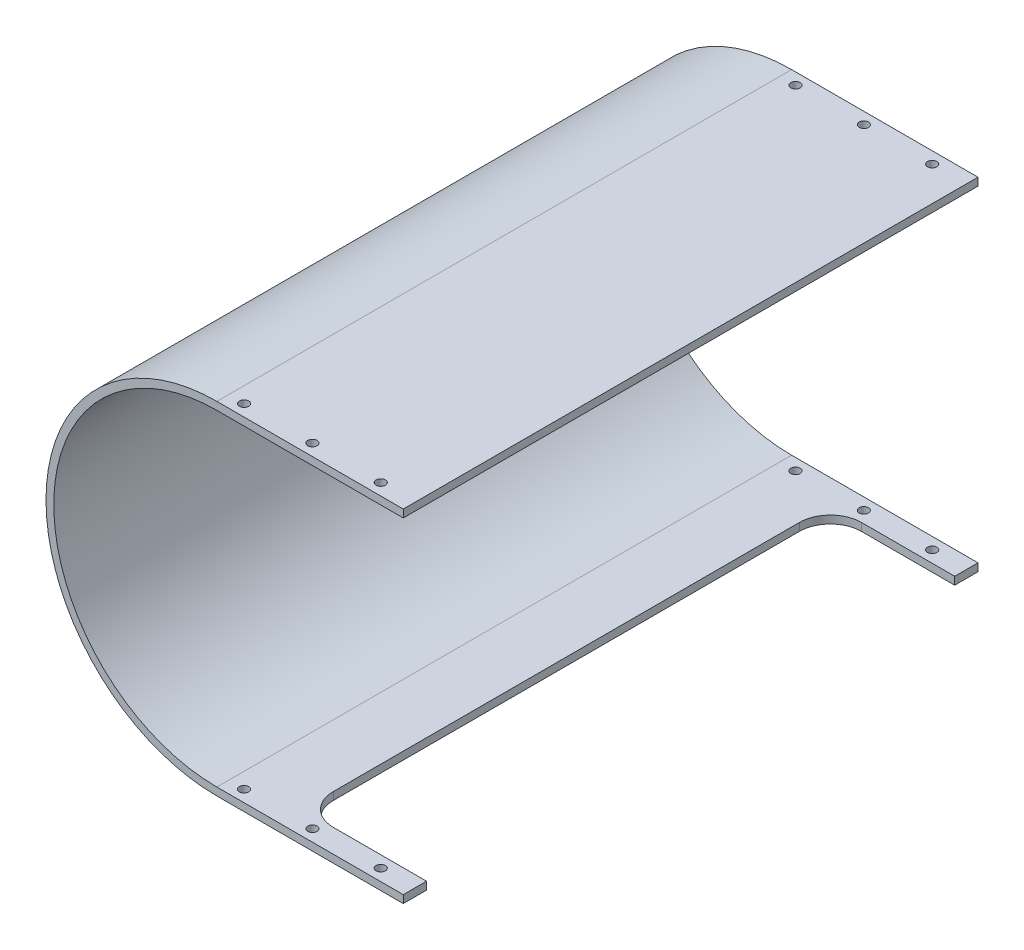
ISO-10303-21;
HEADER;
FILE_DESCRIPTION(('STEP AP214'),'2;1');
FILE_NAME('part.step','',(''),(''),'','','');
FILE_SCHEMA(('AUTOMOTIVE_DESIGN { 1 0 10303 214 1 1 1 1 }'));
ENDSEC;
DATA;
#1=APPLICATION_CONTEXT('core data for automotive mechanical design processes');
#2=APPLICATION_PROTOCOL_DEFINITION('international standard','automotive_design',2000,#1);
#3=PRODUCT_CONTEXT('',#1,'mechanical');
#4=PRODUCT('Part','Part','',(#3));
#5=PRODUCT_RELATED_PRODUCT_CATEGORY('part','',(#4));
#6=PRODUCT_DEFINITION_FORMATION('','',#4);
#7=PRODUCT_DEFINITION_CONTEXT('part definition',#1,'design');
#8=PRODUCT_DEFINITION('design','',#6,#7);
#9=PRODUCT_DEFINITION_SHAPE('','',#8);
#10=(LENGTH_UNIT() NAMED_UNIT(*) SI_UNIT(.MILLI.,.METRE.));
#11=(NAMED_UNIT(*) PLANE_ANGLE_UNIT() SI_UNIT($,.RADIAN.));
#12=(NAMED_UNIT(*) SI_UNIT($,.STERADIAN.) SOLID_ANGLE_UNIT());
#13=UNCERTAINTY_MEASURE_WITH_UNIT(LENGTH_MEASURE(1.E-05),#10,'distance_accuracy_value','');
#14=(GEOMETRIC_REPRESENTATION_CONTEXT(3) GLOBAL_UNCERTAINTY_ASSIGNED_CONTEXT((#13)) GLOBAL_UNIT_ASSIGNED_CONTEXT((#10,
#11,#12)) REPRESENTATION_CONTEXT('',''));
#15=CARTESIAN_POINT('',(0.,0.,0.));
#16=DIRECTION('',(0.,0.,1.));
#17=DIRECTION('',(1.,0.,0.));
#18=AXIS2_PLACEMENT_3D('',#15,#16,#17);
#19=CARTESIAN_POINT('',(0.,-52.5,92.5));
#20=DIRECTION('',(-1.,0.,0.));
#21=DIRECTION('',(0.,0.,1.));
#22=AXIS2_PLACEMENT_3D('',#19,#20,#21);
#23=PLANE('',#22);
#24=DIRECTION('',(0.,0.,-1.));
#25=VECTOR('',#24,1.);
#26=CARTESIAN_POINT('',(0.,-52.5,92.5));
#27=LINE('',#26,#25);
#28=CARTESIAN_POINT('',(0.,-52.5,-85.));
#29=VERTEX_POINT('',#28);
#30=CARTESIAN_POINT('',(0.,-52.5,-92.5));
#31=VERTEX_POINT('',#30);
#32=EDGE_CURVE('E178',#29,#31,#27,.T.);
#33=ORIENTED_EDGE('',*,*,#32,.F.);
#34=DIRECTION('',(0.,-1.,0.));
#35=VECTOR('',#34,1.);
#36=CARTESIAN_POINT('',(0.,-52.5,-85.));
#37=LINE('',#36,#35);
#38=CARTESIAN_POINT('',(0.,-55.,-85.));
#39=VERTEX_POINT('',#38);
#40=EDGE_CURVE('E170',#29,#39,#37,.T.);
#41=ORIENTED_EDGE('',*,*,#40,.T.);
#42=DIRECTION('',(0.,0.,-1.));
#43=VECTOR('',#42,1.);
#44=CARTESIAN_POINT('',(0.,-55.,92.5));
#45=LINE('',#44,#43);
#46=CARTESIAN_POINT('',(0.,-55.,-92.5));
#47=VERTEX_POINT('',#46);
#48=EDGE_CURVE('E177',#39,#47,#45,.T.);
#49=ORIENTED_EDGE('',*,*,#48,.T.);
#50=DIRECTION('',(0.,1.,0.));
#51=VECTOR('',#50,1.);
#52=CARTESIAN_POINT('',(0.,-52.5,-92.5));
#53=LINE('',#52,#51);
#54=EDGE_CURVE('E275',#47,#31,#53,.T.);
#55=ORIENTED_EDGE('',*,*,#54,.T.);
#56=EDGE_LOOP('',(#33,#41,#49,#55));
#57=FACE_BOUND('',#56,.T.);
#58=ADVANCED_FACE('F39',(#57),#23,.F.);
#59=CARTESIAN_POINT('',(-60.,0.,92.5));
#60=DIRECTION('',(0.,0.,-1.));
#61=DIRECTION('',(-1.,0.,0.));
#62=AXIS2_PLACEMENT_3D('',#59,#60,#61);
#63=CYLINDRICAL_SURFACE('',#62,55.);
#64=CARTESIAN_POINT('',(-60.,0.,-92.5));
#65=DIRECTION('',(0.,0.,1.));
#66=DIRECTION('',(1.,0.,0.));
#67=AXIS2_PLACEMENT_3D('',#64,#65,#66);
#68=CIRCLE('',#67,55.);
#69=CARTESIAN_POINT('',(-60.,55.,-92.5));
#70=VERTEX_POINT('',#69);
#71=CARTESIAN_POINT('',(-60.,-55.,-92.5));
#72=VERTEX_POINT('',#71);
#73=EDGE_CURVE('E244',#70,#72,#68,.T.);
#74=ORIENTED_EDGE('',*,*,#73,.T.);
#75=DIRECTION('',(0.,0.,-1.));
#76=VECTOR('',#75,1.);
#77=CARTESIAN_POINT('',(-60.,-55.,92.5));
#78=LINE('',#77,#76);
#79=CARTESIAN_POINT('',(-60.,-55.,92.5));
#80=VERTEX_POINT('',#79);
#81=EDGE_CURVE('E187',#80,#72,#78,.T.);
#82=ORIENTED_EDGE('',*,*,#81,.F.);
#83=CARTESIAN_POINT('',(-60.,0.,92.5));
#84=DIRECTION('',(0.,0.,1.));
#85=DIRECTION('',(1.,0.,0.));
#86=AXIS2_PLACEMENT_3D('',#83,#84,#85);
#87=CIRCLE('',#86,55.);
#88=CARTESIAN_POINT('',(-60.,55.,92.5));
#89=VERTEX_POINT('',#88);
#90=EDGE_CURVE('E245',#89,#80,#87,.T.);
#91=ORIENTED_EDGE('',*,*,#90,.F.);
#92=DIRECTION('',(0.,0.,-1.));
#93=VECTOR('',#92,1.);
#94=CARTESIAN_POINT('',(-60.,55.,92.5));
#95=LINE('',#94,#93);
#96=EDGE_CURVE('E267',#89,#70,#95,.T.);
#97=ORIENTED_EDGE('',*,*,#96,.T.);
#98=EDGE_LOOP('',(#74,#82,#91,#97));
#99=FACE_BOUND('',#98,.T.);
#100=ADVANCED_FACE('F422',(#99),#63,.T.);
#101=CARTESIAN_POINT('',(0.,-55.,92.5));
#102=DIRECTION('',(0.,1.,0.));
#103=DIRECTION('',(0.,0.,1.));
#104=AXIS2_PLACEMENT_3D('',#101,#102,#103);
#105=PLANE('',#104);
#106=CARTESIAN_POINT('',(-55.,-55.,88.75));
#107=DIRECTION('',(0.,1.,0.));
#108=DIRECTION('',(0.,0.,-1.));
#109=AXIS2_PLACEMENT_3D('',#106,#107,#108);
#110=CIRCLE('',#109,1.5);
#111=CARTESIAN_POINT('',(-55.,-55.,87.25));
#112=VERTEX_POINT('',#111);
#113=EDGE_CURVE('E380',#112,#112,#110,.T.);
#114=ORIENTED_EDGE('',*,*,#113,.T.);
#115=EDGE_LOOP('',(#114));
#116=FACE_BOUND('',#115,.T.);
#117=CARTESIAN_POINT('',(-33.,-55.,88.75));
#118=DIRECTION('',(0.,1.,0.));
#119=DIRECTION('',(0.,0.,-1.));
#120=AXIS2_PLACEMENT_3D('',#117,#118,#119);
#121=CIRCLE('',#120,1.5);
#122=CARTESIAN_POINT('',(-33.,-55.,87.25));
#123=VERTEX_POINT('',#122);
#124=EDGE_CURVE('E388',#123,#123,#121,.T.);
#125=ORIENTED_EDGE('',*,*,#124,.T.);
#126=EDGE_LOOP('',(#125));
#127=FACE_BOUND('',#126,.T.);
#128=CARTESIAN_POINT('',(-11.,-55.,88.75));
#129=DIRECTION('',(0.,1.,0.));
#130=DIRECTION('',(0.,0.,-1.));
#131=AXIS2_PLACEMENT_3D('',#128,#129,#130);
#132=CIRCLE('',#131,1.5);
#133=CARTESIAN_POINT('',(-11.,-55.,87.25));
#134=VERTEX_POINT('',#133);
#135=EDGE_CURVE('E394',#134,#134,#132,.T.);
#136=ORIENTED_EDGE('',*,*,#135,.T.);
#137=EDGE_LOOP('',(#136));
#138=FACE_BOUND('',#137,.T.);
#139=CARTESIAN_POINT('',(-11.,-55.,-88.75));
#140=DIRECTION('',(0.,1.,0.));
#141=DIRECTION('',(0.,0.,1.));
#142=AXIS2_PLACEMENT_3D('',#139,#140,#141);
#143=CIRCLE('',#142,1.5);
#144=CARTESIAN_POINT('',(-11.,-55.,-87.25));
#145=VERTEX_POINT('',#144);
#146=EDGE_CURVE('E400',#145,#145,#143,.T.);
#147=ORIENTED_EDGE('',*,*,#146,.T.);
#148=EDGE_LOOP('',(#147));
#149=FACE_BOUND('',#148,.T.);
#150=CARTESIAN_POINT('',(-33.,-55.,-88.75));
#151=DIRECTION('',(0.,1.,0.));
#152=DIRECTION('',(0.,0.,1.));
#153=AXIS2_PLACEMENT_3D('',#150,#151,#152);
#154=CIRCLE('',#153,1.5);
#155=CARTESIAN_POINT('',(-33.,-55.,-87.25));
#156=VERTEX_POINT('',#155);
#157=EDGE_CURVE('E379',#156,#156,#154,.T.);
#158=ORIENTED_EDGE('',*,*,#157,.T.);
#159=EDGE_LOOP('',(#158));
#160=FACE_BOUND('',#159,.T.);
#161=CARTESIAN_POINT('',(-55.,-55.,-88.75));
#162=DIRECTION('',(0.,1.,0.));
#163=DIRECTION('',(0.,0.,1.));
#164=AXIS2_PLACEMENT_3D('',#161,#162,#163);
#165=CIRCLE('',#164,1.5);
#166=CARTESIAN_POINT('',(-55.,-55.,-87.25));
#167=VERTEX_POINT('',#166);
#168=EDGE_CURVE('E372',#167,#167,#165,.T.);
#169=ORIENTED_EDGE('',*,*,#168,.T.);
#170=EDGE_LOOP('',(#169));
#171=FACE_BOUND('',#170,.T.);
#172=ORIENTED_EDGE('',*,*,#48,.F.);
#173=DIRECTION('',(1.,0.,0.));
#174=VECTOR('',#173,1.);
#175=CARTESIAN_POINT('',(-40.,-55.,-85.));
#176=LINE('',#175,#174);
#177=CARTESIAN_POINT('',(-30.,-55.,-85.));
#178=VERTEX_POINT('',#177);
#179=EDGE_CURVE('E226',#178,#39,#176,.T.);
#180=ORIENTED_EDGE('',*,*,#179,.F.);
#181=CARTESIAN_POINT('',(-30.,-55.,-75.));
#182=DIRECTION('',(0.,1.,0.));
#183=DIRECTION('',(0.,0.,1.));
#184=AXIS2_PLACEMENT_3D('',#181,#182,#183);
#185=CIRCLE('',#184,10.);
#186=CARTESIAN_POINT('',(-40.,-55.,-75.));
#187=VERTEX_POINT('',#186);
#188=EDGE_CURVE('E205',#178,#187,#185,.T.);
#189=ORIENTED_EDGE('',*,*,#188,.T.);
#190=DIRECTION('',(0.,0.,-1.));
#191=VECTOR('',#190,1.);
#192=CARTESIAN_POINT('',(-40.,-55.,85.));
#193=LINE('',#192,#191);
#194=CARTESIAN_POINT('',(-40.,-55.,75.));
#195=VERTEX_POINT('',#194);
#196=EDGE_CURVE('E225',#195,#187,#193,.T.);
#197=ORIENTED_EDGE('',*,*,#196,.F.);
#198=CARTESIAN_POINT('',(-30.,-55.,75.));
#199=DIRECTION('',(0.,1.,0.));
#200=DIRECTION('',(0.,0.,1.));
#201=AXIS2_PLACEMENT_3D('',#198,#199,#200);
#202=CIRCLE('',#201,10.);
#203=CARTESIAN_POINT('',(-30.,-55.,85.));
#204=VERTEX_POINT('',#203);
#205=EDGE_CURVE('E48',#195,#204,#202,.T.);
#206=ORIENTED_EDGE('',*,*,#205,.T.);
#207=DIRECTION('',(-1.,0.,0.));
#208=VECTOR('',#207,1.);
#209=CARTESIAN_POINT('',(-40.,-55.,85.));
#210=LINE('',#209,#208);
#211=CARTESIAN_POINT('',(0.,-55.,85.));
#212=VERTEX_POINT('',#211);
#213=EDGE_CURVE('E231',#212,#204,#210,.T.);
#214=ORIENTED_EDGE('',*,*,#213,.F.);
#215=CARTESIAN_POINT('',(0.,-55.,92.5));
#216=VERTEX_POINT('',#215);
#217=EDGE_CURVE('E168',#216,#212,#45,.T.);
#218=ORIENTED_EDGE('',*,*,#217,.F.);
#219=DIRECTION('',(1.,0.,0.));
#220=VECTOR('',#219,1.);
#221=CARTESIAN_POINT('',(0.,-55.,92.5));
#222=LINE('',#221,#220);
#223=EDGE_CURVE('E249',#80,#216,#222,.T.);
#224=ORIENTED_EDGE('',*,*,#223,.F.);
#225=ORIENTED_EDGE('',*,*,#81,.T.);
#226=DIRECTION('',(1.,0.,0.));
#227=VECTOR('',#226,1.);
#228=CARTESIAN_POINT('',(0.,-55.,-92.5));
#229=LINE('',#228,#227);
#230=EDGE_CURVE('E271',#72,#47,#229,.T.);
#231=ORIENTED_EDGE('',*,*,#230,.T.);
#232=EDGE_LOOP('',(#172,#180,#189,#197,#206,#214,#218,#224,#225,#231));
#233=FACE_BOUND('',#232,.T.);
#234=ADVANCED_FACE('F224',(#116,#127,#138,#149,#160,#171,#233),#105,.F.);
#235=ORIENTED_EDGE('',*,*,#217,.T.);
#236=DIRECTION('',(0.,1.,0.));
#237=VECTOR('',#236,1.);
#238=CARTESIAN_POINT('',(0.,-52.5,85.));
#239=LINE('',#238,#237);
#240=CARTESIAN_POINT('',(0.,-52.5,85.));
#241=VERTEX_POINT('',#240);
#242=EDGE_CURVE('E153',#212,#241,#239,.T.);
#243=ORIENTED_EDGE('',*,*,#242,.T.);
#244=CARTESIAN_POINT('',(0.,-52.5,92.5));
#245=VERTEX_POINT('',#244);
#246=EDGE_CURVE('E165',#245,#241,#27,.T.);
#247=ORIENTED_EDGE('',*,*,#246,.F.);
#248=DIRECTION('',(0.,1.,0.));
#249=VECTOR('',#248,1.);
#250=CARTESIAN_POINT('',(0.,-52.5,92.5));
#251=LINE('',#250,#249);
#252=EDGE_CURVE('E253',#216,#245,#251,.T.);
#253=ORIENTED_EDGE('',*,*,#252,.F.);
#254=EDGE_LOOP('',(#235,#243,#247,#253));
#255=FACE_BOUND('',#254,.T.);
#256=ADVANCED_FACE('F163',(#255),#23,.F.);
#257=CARTESIAN_POINT('',(-60.,-52.5,92.5));
#258=DIRECTION('',(0.,-1.,0.));
#259=DIRECTION('',(0.,0.,-1.));
#260=AXIS2_PLACEMENT_3D('',#257,#258,#259);
#261=PLANE('',#260);
#262=CARTESIAN_POINT('',(-55.,-52.5,88.75));
#263=DIRECTION('',(0.,-1.,0.));
#264=DIRECTION('',(0.,0.,-1.));
#265=AXIS2_PLACEMENT_3D('',#262,#263,#264);
#266=CIRCLE('',#265,1.5);
#267=CARTESIAN_POINT('',(-55.,-52.5,87.25));
#268=VERTEX_POINT('',#267);
#269=EDGE_CURVE('E238',#268,#268,#266,.T.);
#270=ORIENTED_EDGE('',*,*,#269,.T.);
#271=EDGE_LOOP('',(#270));
#272=FACE_BOUND('',#271,.T.);
#273=CARTESIAN_POINT('',(-33.,-52.5,88.75));
#274=DIRECTION('',(0.,-1.,0.));
#275=DIRECTION('',(0.,0.,-1.));
#276=AXIS2_PLACEMENT_3D('',#273,#274,#275);
#277=CIRCLE('',#276,1.5);
#278=CARTESIAN_POINT('',(-33.,-52.5,87.25));
#279=VERTEX_POINT('',#278);
#280=EDGE_CURVE('E341',#279,#279,#277,.T.);
#281=ORIENTED_EDGE('',*,*,#280,.T.);
#282=EDGE_LOOP('',(#281));
#283=FACE_BOUND('',#282,.T.);
#284=CARTESIAN_POINT('',(-11.,-52.5,88.75));
#285=DIRECTION('',(0.,-1.,0.));
#286=DIRECTION('',(0.,0.,-1.));
#287=AXIS2_PLACEMENT_3D('',#284,#285,#286);
#288=CIRCLE('',#287,1.5);
#289=CARTESIAN_POINT('',(-11.,-52.5,87.25));
#290=VERTEX_POINT('',#289);
#291=EDGE_CURVE('E347',#290,#290,#288,.T.);
#292=ORIENTED_EDGE('',*,*,#291,.T.);
#293=EDGE_LOOP('',(#292));
#294=FACE_BOUND('',#293,.T.);
#295=CARTESIAN_POINT('',(-11.,-52.5,-88.75));
#296=DIRECTION('',(0.,-1.,0.));
#297=DIRECTION('',(0.,0.,-1.));
#298=AXIS2_PLACEMENT_3D('',#295,#296,#297);
#299=CIRCLE('',#298,1.5);
#300=CARTESIAN_POINT('',(-11.,-52.5,-90.25));
#301=VERTEX_POINT('',#300);
#302=EDGE_CURVE('E353',#301,#301,#299,.T.);
#303=ORIENTED_EDGE('',*,*,#302,.T.);
#304=EDGE_LOOP('',(#303));
#305=FACE_BOUND('',#304,.T.);
#306=CARTESIAN_POINT('',(-33.,-52.5,-88.75));
#307=DIRECTION('',(0.,-1.,0.));
#308=DIRECTION('',(0.,0.,-1.));
#309=AXIS2_PLACEMENT_3D('',#306,#307,#308);
#310=CIRCLE('',#309,1.5);
#311=CARTESIAN_POINT('',(-33.,-52.5,-90.25));
#312=VERTEX_POINT('',#311);
#313=EDGE_CURVE('E359',#312,#312,#310,.T.);
#314=ORIENTED_EDGE('',*,*,#313,.T.);
#315=EDGE_LOOP('',(#314));
#316=FACE_BOUND('',#315,.T.);
#317=CARTESIAN_POINT('',(-55.,-52.5,-88.75));
#318=DIRECTION('',(0.,-1.,0.));
#319=DIRECTION('',(0.,0.,-1.));
#320=AXIS2_PLACEMENT_3D('',#317,#318,#319);
#321=CIRCLE('',#320,1.5);
#322=CARTESIAN_POINT('',(-55.,-52.5,-90.25));
#323=VERTEX_POINT('',#322);
#324=EDGE_CURVE('E365',#323,#323,#321,.T.);
#325=ORIENTED_EDGE('',*,*,#324,.T.);
#326=EDGE_LOOP('',(#325));
#327=FACE_BOUND('',#326,.T.);
#328=DIRECTION('',(0.,0.,1.));
#329=VECTOR('',#328,1.);
#330=CARTESIAN_POINT('',(-40.,-52.5,85.));
#331=LINE('',#330,#329);
#332=CARTESIAN_POINT('',(-40.,-52.5,-75.));
#333=VERTEX_POINT('',#332);
#334=CARTESIAN_POINT('',(-40.,-52.5,75.));
#335=VERTEX_POINT('',#334);
#336=EDGE_CURVE('E158',#333,#335,#331,.T.);
#337=ORIENTED_EDGE('',*,*,#336,.F.);
#338=CARTESIAN_POINT('',(-30.,-52.5,-75.));
#339=DIRECTION('',(0.,-1.,0.));
#340=DIRECTION('',(0.,0.,-1.));
#341=AXIS2_PLACEMENT_3D('',#338,#339,#340);
#342=CIRCLE('',#341,10.);
#343=CARTESIAN_POINT('',(-30.,-52.5,-85.));
#344=VERTEX_POINT('',#343);
#345=EDGE_CURVE('E207',#333,#344,#342,.T.);
#346=ORIENTED_EDGE('',*,*,#345,.T.);
#347=DIRECTION('',(1.,0.,0.));
#348=VECTOR('',#347,1.);
#349=CARTESIAN_POINT('',(-60.,-52.5,-85.));
#350=LINE('',#349,#348);
#351=EDGE_CURVE('E191',#344,#29,#350,.T.);
#352=ORIENTED_EDGE('',*,*,#351,.T.);
#353=ORIENTED_EDGE('',*,*,#32,.T.);
#354=DIRECTION('',(-1.,0.,0.));
#355=VECTOR('',#354,1.);
#356=CARTESIAN_POINT('',(-60.,-52.5,-92.5));
#357=LINE('',#356,#355);
#358=CARTESIAN_POINT('',(-60.,-52.5,-92.5));
#359=VERTEX_POINT('',#358);
#360=EDGE_CURVE('E278',#31,#359,#357,.T.);
#361=ORIENTED_EDGE('',*,*,#360,.T.);
#362=DIRECTION('',(0.,0.,-1.));
#363=VECTOR('',#362,1.);
#364=CARTESIAN_POINT('',(-60.,-52.5,92.5));
#365=LINE('',#364,#363);
#366=CARTESIAN_POINT('',(-60.,-52.5,92.5));
#367=VERTEX_POINT('',#366);
#368=EDGE_CURVE('E183',#367,#359,#365,.T.);
#369=ORIENTED_EDGE('',*,*,#368,.F.);
#370=DIRECTION('',(-1.,0.,0.));
#371=VECTOR('',#370,1.);
#372=CARTESIAN_POINT('',(-60.,-52.5,92.5));
#373=LINE('',#372,#371);
#374=EDGE_CURVE('E175',#245,#367,#373,.T.);
#375=ORIENTED_EDGE('',*,*,#374,.F.);
#376=ORIENTED_EDGE('',*,*,#246,.T.);
#377=DIRECTION('',(1.,0.,0.));
#378=VECTOR('',#377,1.);
#379=CARTESIAN_POINT('',(-40.,-52.5,85.));
#380=LINE('',#379,#378);
#381=CARTESIAN_POINT('',(-30.,-52.5,85.));
#382=VERTEX_POINT('',#381);
#383=EDGE_CURVE('E150',#382,#241,#380,.T.);
#384=ORIENTED_EDGE('',*,*,#383,.F.);
#385=CARTESIAN_POINT('',(-30.,-52.5,75.));
#386=DIRECTION('',(0.,-1.,0.));
#387=DIRECTION('',(0.,0.,-1.));
#388=AXIS2_PLACEMENT_3D('',#385,#386,#387);
#389=CIRCLE('',#388,10.);
#390=EDGE_CURVE('E11',#382,#335,#389,.T.);
#391=ORIENTED_EDGE('',*,*,#390,.T.);
#392=EDGE_LOOP('',(#337,#346,#352,#353,#361,#369,#375,#376,#384,#391));
#393=FACE_BOUND('',#392,.T.);
#394=ADVANCED_FACE('F173',(#272,#283,#294,#305,#316,#327,#393),#261,.F.);
#395=CARTESIAN_POINT('',(-60.,0.,92.5));
#396=DIRECTION('',(0.,0.,-1.));
#397=DIRECTION('',(-1.,0.,0.));
#398=AXIS2_PLACEMENT_3D('',#395,#396,#397);
#399=CYLINDRICAL_SURFACE('',#398,52.5);
#400=CARTESIAN_POINT('',(-60.,0.,-92.5));
#401=DIRECTION('',(0.,0.,-1.));
#402=DIRECTION('',(1.,0.,0.));
#403=AXIS2_PLACEMENT_3D('',#400,#401,#402);
#404=CIRCLE('',#403,52.5);
#405=CARTESIAN_POINT('',(-60.,52.5,-92.5));
#406=VERTEX_POINT('',#405);
#407=EDGE_CURVE('E281',#359,#406,#404,.T.);
#408=ORIENTED_EDGE('',*,*,#407,.T.);
#409=DIRECTION('',(0.,0.,-1.));
#410=VECTOR('',#409,1.);
#411=CARTESIAN_POINT('',(-60.,52.5,92.5));
#412=LINE('',#411,#410);
#413=CARTESIAN_POINT('',(-60.,52.5,92.5));
#414=VERTEX_POINT('',#413);
#415=EDGE_CURVE('E301',#414,#406,#412,.T.);
#416=ORIENTED_EDGE('',*,*,#415,.F.);
#417=CARTESIAN_POINT('',(-60.,0.,92.5));
#418=DIRECTION('',(0.,0.,-1.));
#419=DIRECTION('',(1.,0.,0.));
#420=AXIS2_PLACEMENT_3D('',#417,#418,#419);
#421=CIRCLE('',#420,52.5);
#422=EDGE_CURVE('E258',#367,#414,#421,.T.);
#423=ORIENTED_EDGE('',*,*,#422,.F.);
#424=ORIENTED_EDGE('',*,*,#368,.T.);
#425=EDGE_LOOP('',(#408,#416,#423,#424));
#426=FACE_BOUND('',#425,.T.);
#427=ADVANCED_FACE('F313',(#426),#399,.F.);
#428=CARTESIAN_POINT('',(-60.,52.5,92.5));
#429=DIRECTION('',(0.,1.,0.));
#430=DIRECTION('',(0.,0.,1.));
#431=AXIS2_PLACEMENT_3D('',#428,#429,#430);
#432=PLANE('',#431);
#433=CARTESIAN_POINT('',(-55.,52.5,88.75));
#434=DIRECTION('',(0.,1.,0.));
#435=DIRECTION('',(0.,0.,1.));
#436=AXIS2_PLACEMENT_3D('',#433,#434,#435);
#437=CIRCLE('',#436,1.5);
#438=CARTESIAN_POINT('',(-55.,52.5,90.25));
#439=VERTEX_POINT('',#438);
#440=EDGE_CURVE('E338',#439,#439,#437,.T.);
#441=ORIENTED_EDGE('',*,*,#440,.T.);
#442=EDGE_LOOP('',(#441));
#443=FACE_BOUND('',#442,.T.);
#444=CARTESIAN_POINT('',(-33.,52.5,88.75));
#445=DIRECTION('',(0.,1.,0.));
#446=DIRECTION('',(0.,0.,1.));
#447=AXIS2_PLACEMENT_3D('',#444,#445,#446);
#448=CIRCLE('',#447,1.5);
#449=CARTESIAN_POINT('',(-33.,52.5,90.25));
#450=VERTEX_POINT('',#449);
#451=EDGE_CURVE('E344',#450,#450,#448,.T.);
#452=ORIENTED_EDGE('',*,*,#451,.T.);
#453=EDGE_LOOP('',(#452));
#454=FACE_BOUND('',#453,.T.);
#455=CARTESIAN_POINT('',(-11.,52.5,88.75));
#456=DIRECTION('',(0.,1.,0.));
#457=DIRECTION('',(0.,0.,1.));
#458=AXIS2_PLACEMENT_3D('',#455,#456,#457);
#459=CIRCLE('',#458,1.5);
#460=CARTESIAN_POINT('',(-11.,52.5,90.25));
#461=VERTEX_POINT('',#460);
#462=EDGE_CURVE('E350',#461,#461,#459,.T.);
#463=ORIENTED_EDGE('',*,*,#462,.T.);
#464=EDGE_LOOP('',(#463));
#465=FACE_BOUND('',#464,.T.);
#466=CARTESIAN_POINT('',(-11.,52.5,-88.75));
#467=DIRECTION('',(0.,1.,0.));
#468=DIRECTION('',(0.,0.,1.));
#469=AXIS2_PLACEMENT_3D('',#466,#467,#468);
#470=CIRCLE('',#469,1.5);
#471=CARTESIAN_POINT('',(-11.,52.5,-87.25));
#472=VERTEX_POINT('',#471);
#473=EDGE_CURVE('E356',#472,#472,#470,.T.);
#474=ORIENTED_EDGE('',*,*,#473,.T.);
#475=EDGE_LOOP('',(#474));
#476=FACE_BOUND('',#475,.T.);
#477=CARTESIAN_POINT('',(-33.,52.5,-88.75));
#478=DIRECTION('',(0.,1.,0.));
#479=DIRECTION('',(0.,0.,1.));
#480=AXIS2_PLACEMENT_3D('',#477,#478,#479);
#481=CIRCLE('',#480,1.5);
#482=CARTESIAN_POINT('',(-33.,52.5,-87.25));
#483=VERTEX_POINT('',#482);
#484=EDGE_CURVE('E362',#483,#483,#481,.T.);
#485=ORIENTED_EDGE('',*,*,#484,.T.);
#486=EDGE_LOOP('',(#485));
#487=FACE_BOUND('',#486,.T.);
#488=CARTESIAN_POINT('',(-55.,52.5,-88.75));
#489=DIRECTION('',(0.,1.,0.));
#490=DIRECTION('',(0.,0.,1.));
#491=AXIS2_PLACEMENT_3D('',#488,#489,#490);
#492=CIRCLE('',#491,1.5);
#493=CARTESIAN_POINT('',(-55.,52.5,-87.25));
#494=VERTEX_POINT('',#493);
#495=EDGE_CURVE('E369',#494,#494,#492,.T.);
#496=ORIENTED_EDGE('',*,*,#495,.T.);
#497=EDGE_LOOP('',(#496));
#498=FACE_BOUND('',#497,.T.);
#499=DIRECTION('',(1.,0.,0.));
#500=VECTOR('',#499,1.);
#501=CARTESIAN_POINT('',(-60.,52.5,-92.5));
#502=LINE('',#501,#500);
#503=CARTESIAN_POINT('',(0.,52.5,-92.5));
#504=VERTEX_POINT('',#503);
#505=EDGE_CURVE('E284',#406,#504,#502,.T.);
#506=ORIENTED_EDGE('',*,*,#505,.T.);
#507=DIRECTION('',(0.,0.,-1.));
#508=VECTOR('',#507,1.);
#509=CARTESIAN_POINT('',(0.,52.5,92.5));
#510=LINE('',#509,#508);
#511=CARTESIAN_POINT('',(0.,52.5,92.5));
#512=VERTEX_POINT('',#511);
#513=EDGE_CURVE('E298',#512,#504,#510,.T.);
#514=ORIENTED_EDGE('',*,*,#513,.F.);
#515=DIRECTION('',(1.,0.,0.));
#516=VECTOR('',#515,1.);
#517=CARTESIAN_POINT('',(-60.,52.5,92.5));
#518=LINE('',#517,#516);
#519=EDGE_CURVE('E261',#414,#512,#518,.T.);
#520=ORIENTED_EDGE('',*,*,#519,.F.);
#521=ORIENTED_EDGE('',*,*,#415,.T.);
#522=EDGE_LOOP('',(#506,#514,#520,#521));
#523=FACE_BOUND('',#522,.T.);
#524=ADVANCED_FACE('F322',(#443,#454,#465,#476,#487,#498,#523),#432,.F.);
#525=CARTESIAN_POINT('',(0.,55.,92.5));
#526=DIRECTION('',(-1.,0.,0.));
#527=DIRECTION('',(0.,0.,1.));
#528=AXIS2_PLACEMENT_3D('',#525,#526,#527);
#529=PLANE('',#528);
#530=DIRECTION('',(0.,1.,0.));
#531=VECTOR('',#530,1.);
#532=CARTESIAN_POINT('',(0.,55.,-92.5));
#533=LINE('',#532,#531);
#534=CARTESIAN_POINT('',(0.,55.,-92.5));
#535=VERTEX_POINT('',#534);
#536=EDGE_CURVE('E287',#504,#535,#533,.T.);
#537=ORIENTED_EDGE('',*,*,#536,.T.);
#538=DIRECTION('',(0.,0.,-1.));
#539=VECTOR('',#538,1.);
#540=CARTESIAN_POINT('',(0.,55.,92.5));
#541=LINE('',#540,#539);
#542=CARTESIAN_POINT('',(0.,55.,92.5));
#543=VERTEX_POINT('',#542);
#544=EDGE_CURVE('E294',#543,#535,#541,.T.);
#545=ORIENTED_EDGE('',*,*,#544,.F.);
#546=DIRECTION('',(0.,1.,0.));
#547=VECTOR('',#546,1.);
#548=CARTESIAN_POINT('',(0.,55.,92.5));
#549=LINE('',#548,#547);
#550=EDGE_CURVE('E263',#512,#543,#549,.T.);
#551=ORIENTED_EDGE('',*,*,#550,.F.);
#552=ORIENTED_EDGE('',*,*,#513,.T.);
#553=EDGE_LOOP('',(#537,#545,#551,#552));
#554=FACE_BOUND('',#553,.T.);
#555=ADVANCED_FACE('F325',(#554),#529,.F.);
#556=CARTESIAN_POINT('',(-60.,55.,92.5));
#557=DIRECTION('',(0.,-1.,0.));
#558=DIRECTION('',(0.,0.,-1.));
#559=AXIS2_PLACEMENT_3D('',#556,#557,#558);
#560=PLANE('',#559);
#561=CARTESIAN_POINT('',(-55.,55.,88.75));
#562=DIRECTION('',(0.,1.,0.));
#563=DIRECTION('',(0.,0.,-1.));
#564=AXIS2_PLACEMENT_3D('',#561,#562,#563);
#565=CIRCLE('',#564,1.5);
#566=CARTESIAN_POINT('',(-55.,55.,87.25));
#567=VERTEX_POINT('',#566);
#568=EDGE_CURVE('E385',#567,#567,#565,.T.);
#569=ORIENTED_EDGE('',*,*,#568,.F.);
#570=EDGE_LOOP('',(#569));
#571=FACE_BOUND('',#570,.T.);
#572=CARTESIAN_POINT('',(-33.,55.,88.75));
#573=DIRECTION('',(0.,1.,0.));
#574=DIRECTION('',(0.,0.,-1.));
#575=AXIS2_PLACEMENT_3D('',#572,#573,#574);
#576=CIRCLE('',#575,1.5);
#577=CARTESIAN_POINT('',(-33.,55.,87.25));
#578=VERTEX_POINT('',#577);
#579=EDGE_CURVE('E384',#578,#578,#576,.T.);
#580=ORIENTED_EDGE('',*,*,#579,.F.);
#581=EDGE_LOOP('',(#580));
#582=FACE_BOUND('',#581,.T.);
#583=CARTESIAN_POINT('',(-11.,55.,88.75));
#584=DIRECTION('',(0.,1.,0.));
#585=DIRECTION('',(0.,0.,-1.));
#586=AXIS2_PLACEMENT_3D('',#583,#584,#585);
#587=CIRCLE('',#586,1.5);
#588=CARTESIAN_POINT('',(-11.,55.,87.25));
#589=VERTEX_POINT('',#588);
#590=EDGE_CURVE('E391',#589,#589,#587,.T.);
#591=ORIENTED_EDGE('',*,*,#590,.F.);
#592=EDGE_LOOP('',(#591));
#593=FACE_BOUND('',#592,.T.);
#594=CARTESIAN_POINT('',(-11.,55.,-88.75));
#595=DIRECTION('',(0.,1.,0.));
#596=DIRECTION('',(0.,0.,1.));
#597=AXIS2_PLACEMENT_3D('',#594,#595,#596);
#598=CIRCLE('',#597,1.5);
#599=CARTESIAN_POINT('',(-11.,55.,-87.25));
#600=VERTEX_POINT('',#599);
#601=EDGE_CURVE('E397',#600,#600,#598,.T.);
#602=ORIENTED_EDGE('',*,*,#601,.F.);
#603=EDGE_LOOP('',(#602));
#604=FACE_BOUND('',#603,.T.);
#605=CARTESIAN_POINT('',(-33.,55.,-88.75));
#606=DIRECTION('',(0.,1.,0.));
#607=DIRECTION('',(0.,0.,1.));
#608=AXIS2_PLACEMENT_3D('',#605,#606,#607);
#609=CIRCLE('',#608,1.5);
#610=CARTESIAN_POINT('',(-33.,55.,-87.25));
#611=VERTEX_POINT('',#610);
#612=EDGE_CURVE('E403',#611,#611,#609,.T.);
#613=ORIENTED_EDGE('',*,*,#612,.F.);
#614=EDGE_LOOP('',(#613));
#615=FACE_BOUND('',#614,.T.);
#616=CARTESIAN_POINT('',(-55.,55.,-88.75));
#617=DIRECTION('',(0.,1.,0.));
#618=DIRECTION('',(0.,0.,1.));
#619=AXIS2_PLACEMENT_3D('',#616,#617,#618);
#620=CIRCLE('',#619,1.5);
#621=CARTESIAN_POINT('',(-55.,55.,-87.25));
#622=VERTEX_POINT('',#621);
#623=EDGE_CURVE('E376',#622,#622,#620,.T.);
#624=ORIENTED_EDGE('',*,*,#623,.F.);
#625=EDGE_LOOP('',(#624));
#626=FACE_BOUND('',#625,.T.);
#627=DIRECTION('',(-1.,0.,0.));
#628=VECTOR('',#627,1.);
#629=CARTESIAN_POINT('',(-60.,55.,-92.5));
#630=LINE('',#629,#628);
#631=EDGE_CURVE('E250',#535,#70,#630,.T.);
#632=ORIENTED_EDGE('',*,*,#631,.T.);
#633=ORIENTED_EDGE('',*,*,#96,.F.);
#634=DIRECTION('',(-1.,0.,0.));
#635=VECTOR('',#634,1.);
#636=CARTESIAN_POINT('',(-60.,55.,92.5));
#637=LINE('',#636,#635);
#638=EDGE_CURVE('E265',#543,#89,#637,.T.);
#639=ORIENTED_EDGE('',*,*,#638,.F.);
#640=ORIENTED_EDGE('',*,*,#544,.T.);
#641=EDGE_LOOP('',(#632,#633,#639,#640));
#642=FACE_BOUND('',#641,.T.);
#643=ADVANCED_FACE('F414',(#571,#582,#593,#604,#615,#626,#642),#560,.F.);
#644=CARTESIAN_POINT('',(-60.,0.,92.5));
#645=DIRECTION('',(0.,0.,1.));
#646=DIRECTION('',(1.,0.,0.));
#647=AXIS2_PLACEMENT_3D('',#644,#645,#646);
#648=PLANE('',#647);
#649=ORIENTED_EDGE('',*,*,#90,.T.);
#650=ORIENTED_EDGE('',*,*,#223,.T.);
#651=ORIENTED_EDGE('',*,*,#252,.T.);
#652=ORIENTED_EDGE('',*,*,#374,.T.);
#653=ORIENTED_EDGE('',*,*,#422,.T.);
#654=ORIENTED_EDGE('',*,*,#519,.T.);
#655=ORIENTED_EDGE('',*,*,#550,.T.);
#656=ORIENTED_EDGE('',*,*,#638,.T.);
#657=EDGE_LOOP('',(#649,#650,#651,#652,#653,#654,#655,#656));
#658=FACE_BOUND('',#657,.T.);
#659=ADVANCED_FACE('F329',(#658),#648,.T.);
#660=CARTESIAN_POINT('',(-60.,0.,-92.5));
#661=DIRECTION('',(0.,0.,1.));
#662=DIRECTION('',(1.,0.,0.));
#663=AXIS2_PLACEMENT_3D('',#660,#661,#662);
#664=PLANE('',#663);
#665=ORIENTED_EDGE('',*,*,#73,.F.);
#666=ORIENTED_EDGE('',*,*,#631,.F.);
#667=ORIENTED_EDGE('',*,*,#536,.F.);
#668=ORIENTED_EDGE('',*,*,#505,.F.);
#669=ORIENTED_EDGE('',*,*,#407,.F.);
#670=ORIENTED_EDGE('',*,*,#360,.F.);
#671=ORIENTED_EDGE('',*,*,#54,.F.);
#672=ORIENTED_EDGE('',*,*,#230,.F.);
#673=EDGE_LOOP('',(#665,#666,#667,#668,#669,#670,#671,#672));
#674=FACE_BOUND('',#673,.T.);
#675=ADVANCED_FACE('F317',(#674),#664,.F.);
#676=CARTESIAN_POINT('',(-40.,135.382942280559,-85.));
#677=DIRECTION('',(0.,0.,-1.));
#678=DIRECTION('',(-1.,0.,0.));
#679=AXIS2_PLACEMENT_3D('',#676,#677,#678);
#680=PLANE('',#679);
#681=ORIENTED_EDGE('',*,*,#351,.F.);
#682=DIRECTION('',(0.,-1.,0.));
#683=VECTOR('',#682,1.);
#684=CARTESIAN_POINT('',(-30.,-55.,-85.));
#685=LINE('',#684,#683);
#686=EDGE_CURVE('E194',#344,#178,#685,.T.);
#687=ORIENTED_EDGE('',*,*,#686,.T.);
#688=ORIENTED_EDGE('',*,*,#179,.T.);
#689=ORIENTED_EDGE('',*,*,#40,.F.);
#690=EDGE_LOOP('',(#681,#687,#688,#689));
#691=FACE_BOUND('',#690,.T.);
#692=ADVANCED_FACE('F217',(#691),#680,.F.);
#693=CARTESIAN_POINT('',(-40.,135.382942280559,85.));
#694=DIRECTION('',(0.,0.,1.));
#695=DIRECTION('',(1.,0.,0.));
#696=AXIS2_PLACEMENT_3D('',#693,#694,#695);
#697=PLANE('',#696);
#698=ORIENTED_EDGE('',*,*,#213,.T.);
#699=DIRECTION('',(0.,-1.,0.));
#700=VECTOR('',#699,1.);
#701=CARTESIAN_POINT('',(-30.,-52.5,85.));
#702=LINE('',#701,#700);
#703=EDGE_CURVE('E55',#204,#382,#702,.F.);
#704=ORIENTED_EDGE('',*,*,#703,.T.);
#705=ORIENTED_EDGE('',*,*,#383,.T.);
#706=ORIENTED_EDGE('',*,*,#242,.F.);
#707=EDGE_LOOP('',(#698,#704,#705,#706));
#708=FACE_BOUND('',#707,.T.);
#709=ADVANCED_FACE('F152',(#708),#697,.F.);
#710=CARTESIAN_POINT('',(-40.,135.382942280559,85.));
#711=DIRECTION('',(-1.,0.,0.));
#712=DIRECTION('',(0.,0.,1.));
#713=AXIS2_PLACEMENT_3D('',#710,#711,#712);
#714=PLANE('',#713);
#715=ORIENTED_EDGE('',*,*,#196,.T.);
#716=DIRECTION('',(0.,-1.,0.));
#717=VECTOR('',#716,1.);
#718=CARTESIAN_POINT('',(-40.,-52.5,-75.));
#719=LINE('',#718,#717);
#720=EDGE_CURVE('E201',#187,#333,#719,.F.);
#721=ORIENTED_EDGE('',*,*,#720,.T.);
#722=ORIENTED_EDGE('',*,*,#336,.T.);
#723=DIRECTION('',(0.,-1.,0.));
#724=VECTOR('',#723,1.);
#725=CARTESIAN_POINT('',(-40.,-55.,75.));
#726=LINE('',#725,#724);
#727=EDGE_CURVE('E197',#335,#195,#726,.T.);
#728=ORIENTED_EDGE('',*,*,#727,.T.);
#729=EDGE_LOOP('',(#715,#721,#722,#728));
#730=FACE_BOUND('',#729,.T.);
#731=ADVANCED_FACE('F228',(#730),#714,.F.);
#732=CARTESIAN_POINT('',(-30.,135.382942280559,-75.));
#733=DIRECTION('',(0.,1.,0.));
#734=DIRECTION('',(0.,0.,1.));
#735=AXIS2_PLACEMENT_3D('',#732,#733,#734);
#736=CYLINDRICAL_SURFACE('',#735,10.);
#737=ORIENTED_EDGE('',*,*,#345,.F.);
#738=ORIENTED_EDGE('',*,*,#720,.F.);
#739=ORIENTED_EDGE('',*,*,#188,.F.);
#740=ORIENTED_EDGE('',*,*,#686,.F.);
#741=EDGE_LOOP('',(#737,#738,#739,#740));
#742=FACE_BOUND('',#741,.T.);
#743=ADVANCED_FACE('F221',(#742),#736,.F.);
#744=CARTESIAN_POINT('',(-30.,135.382942280559,75.));
#745=DIRECTION('',(0.,1.,0.));
#746=DIRECTION('',(0.,0.,1.));
#747=AXIS2_PLACEMENT_3D('',#744,#745,#746);
#748=CYLINDRICAL_SURFACE('',#747,10.);
#749=ORIENTED_EDGE('',*,*,#390,.F.);
#750=ORIENTED_EDGE('',*,*,#703,.F.);
#751=ORIENTED_EDGE('',*,*,#205,.F.);
#752=ORIENTED_EDGE('',*,*,#727,.F.);
#753=EDGE_LOOP('',(#749,#750,#751,#752));
#754=FACE_BOUND('',#753,.T.);
#755=ADVANCED_FACE('F41',(#754),#748,.F.);
#756=CARTESIAN_POINT('',(-55.,-55.,-88.75));
#757=DIRECTION('',(0.,1.,0.));
#758=DIRECTION('',(0.,0.,1.));
#759=AXIS2_PLACEMENT_3D('',#756,#757,#758);
#760=CYLINDRICAL_SURFACE('',#759,1.5);
#761=ORIENTED_EDGE('',*,*,#623,.T.);
#762=EDGE_LOOP('',(#761));
#763=FACE_BOUND('',#762,.T.);
#764=ORIENTED_EDGE('',*,*,#495,.F.);
#765=EDGE_LOOP('',(#764));
#766=FACE_BOUND('',#765,.T.);
#767=ADVANCED_FACE('F447',(#763,#766),#760,.F.);
#768=CARTESIAN_POINT('',(-33.,-55.,-88.75));
#769=DIRECTION('',(0.,1.,0.));
#770=DIRECTION('',(0.,0.,1.));
#771=AXIS2_PLACEMENT_3D('',#768,#769,#770);
#772=CYLINDRICAL_SURFACE('',#771,1.5);
#773=ORIENTED_EDGE('',*,*,#612,.T.);
#774=EDGE_LOOP('',(#773));
#775=FACE_BOUND('',#774,.T.);
#776=ORIENTED_EDGE('',*,*,#484,.F.);
#777=EDGE_LOOP('',(#776));
#778=FACE_BOUND('',#777,.T.);
#779=ADVANCED_FACE('F411',(#775,#778),#772,.F.);
#780=CARTESIAN_POINT('',(-11.,-55.,-88.75));
#781=DIRECTION('',(0.,1.,0.));
#782=DIRECTION('',(0.,0.,1.));
#783=AXIS2_PLACEMENT_3D('',#780,#781,#782);
#784=CYLINDRICAL_SURFACE('',#783,1.5);
#785=ORIENTED_EDGE('',*,*,#601,.T.);
#786=EDGE_LOOP('',(#785));
#787=FACE_BOUND('',#786,.T.);
#788=ORIENTED_EDGE('',*,*,#473,.F.);
#789=EDGE_LOOP('',(#788));
#790=FACE_BOUND('',#789,.T.);
#791=ADVANCED_FACE('F550',(#787,#790),#784,.F.);
#792=CARTESIAN_POINT('',(-11.,-55.,88.75));
#793=DIRECTION('',(0.,1.,0.));
#794=DIRECTION('',(0.,0.,1.));
#795=AXIS2_PLACEMENT_3D('',#792,#793,#794);
#796=CYLINDRICAL_SURFACE('',#795,1.5);
#797=ORIENTED_EDGE('',*,*,#590,.T.);
#798=EDGE_LOOP('',(#797));
#799=FACE_BOUND('',#798,.T.);
#800=ORIENTED_EDGE('',*,*,#462,.F.);
#801=EDGE_LOOP('',(#800));
#802=FACE_BOUND('',#801,.T.);
#803=ADVANCED_FACE('F560',(#799,#802),#796,.F.);
#804=CARTESIAN_POINT('',(-33.,-55.,88.75));
#805=DIRECTION('',(0.,1.,0.));
#806=DIRECTION('',(0.,0.,1.));
#807=AXIS2_PLACEMENT_3D('',#804,#805,#806);
#808=CYLINDRICAL_SURFACE('',#807,1.5);
#809=ORIENTED_EDGE('',*,*,#579,.T.);
#810=EDGE_LOOP('',(#809));
#811=FACE_BOUND('',#810,.T.);
#812=ORIENTED_EDGE('',*,*,#451,.F.);
#813=EDGE_LOOP('',(#812));
#814=FACE_BOUND('',#813,.T.);
#815=ADVANCED_FACE('F571',(#811,#814),#808,.F.);
#816=CARTESIAN_POINT('',(-55.,-55.,88.75));
#817=DIRECTION('',(0.,1.,0.));
#818=DIRECTION('',(0.,0.,1.));
#819=AXIS2_PLACEMENT_3D('',#816,#817,#818);
#820=CYLINDRICAL_SURFACE('',#819,1.5);
#821=ORIENTED_EDGE('',*,*,#568,.T.);
#822=EDGE_LOOP('',(#821));
#823=FACE_BOUND('',#822,.T.);
#824=ORIENTED_EDGE('',*,*,#440,.F.);
#825=EDGE_LOOP('',(#824));
#826=FACE_BOUND('',#825,.T.);
#827=ADVANCED_FACE('F582',(#823,#826),#820,.F.);
#828=ORIENTED_EDGE('',*,*,#168,.F.);
#829=EDGE_LOOP('',(#828));
#830=FACE_BOUND('',#829,.T.);
#831=ORIENTED_EDGE('',*,*,#324,.F.);
#832=EDGE_LOOP('',(#831));
#833=FACE_BOUND('',#832,.T.);
#834=ADVANCED_FACE('F542',(#830,#833),#760,.F.);
#835=ORIENTED_EDGE('',*,*,#157,.F.);
#836=EDGE_LOOP('',(#835));
#837=FACE_BOUND('',#836,.T.);
#838=ORIENTED_EDGE('',*,*,#313,.F.);
#839=EDGE_LOOP('',(#838));
#840=FACE_BOUND('',#839,.T.);
#841=ADVANCED_FACE('F552',(#837,#840),#772,.F.);
#842=ORIENTED_EDGE('',*,*,#146,.F.);
#843=EDGE_LOOP('',(#842));
#844=FACE_BOUND('',#843,.T.);
#845=ORIENTED_EDGE('',*,*,#302,.F.);
#846=EDGE_LOOP('',(#845));
#847=FACE_BOUND('',#846,.T.);
#848=ADVANCED_FACE('F563',(#844,#847),#784,.F.);
#849=ORIENTED_EDGE('',*,*,#135,.F.);
#850=EDGE_LOOP('',(#849));
#851=FACE_BOUND('',#850,.T.);
#852=ORIENTED_EDGE('',*,*,#291,.F.);
#853=EDGE_LOOP('',(#852));
#854=FACE_BOUND('',#853,.T.);
#855=ADVANCED_FACE('F574',(#851,#854),#796,.F.);
#856=ORIENTED_EDGE('',*,*,#124,.F.);
#857=EDGE_LOOP('',(#856));
#858=FACE_BOUND('',#857,.T.);
#859=ORIENTED_EDGE('',*,*,#280,.F.);
#860=EDGE_LOOP('',(#859));
#861=FACE_BOUND('',#860,.T.);
#862=ADVANCED_FACE('F585',(#858,#861),#808,.F.);
#863=ORIENTED_EDGE('',*,*,#113,.F.);
#864=EDGE_LOOP('',(#863));
#865=FACE_BOUND('',#864,.T.);
#866=ORIENTED_EDGE('',*,*,#269,.F.);
#867=EDGE_LOOP('',(#866));
#868=FACE_BOUND('',#867,.T.);
#869=ADVANCED_FACE('F595',(#865,#868),#820,.F.);
#870=CLOSED_SHELL('',(#58,#100,#234,#256,#394,#427,#524,#555,#643,#659,#675,#692,#709,#731,#743,
#755,#767,#779,#791,#803,#815,#827,#834,#841,#848,#855,#862,#869));
#871=MANIFOLD_SOLID_BREP('B2',#870);
#872=ADVANCED_BREP_SHAPE_REPRESENTATION('',(#18,#871),#14);
#873=SHAPE_DEFINITION_REPRESENTATION(#9,#872);
ENDSEC;
END-ISO-10303-21;
